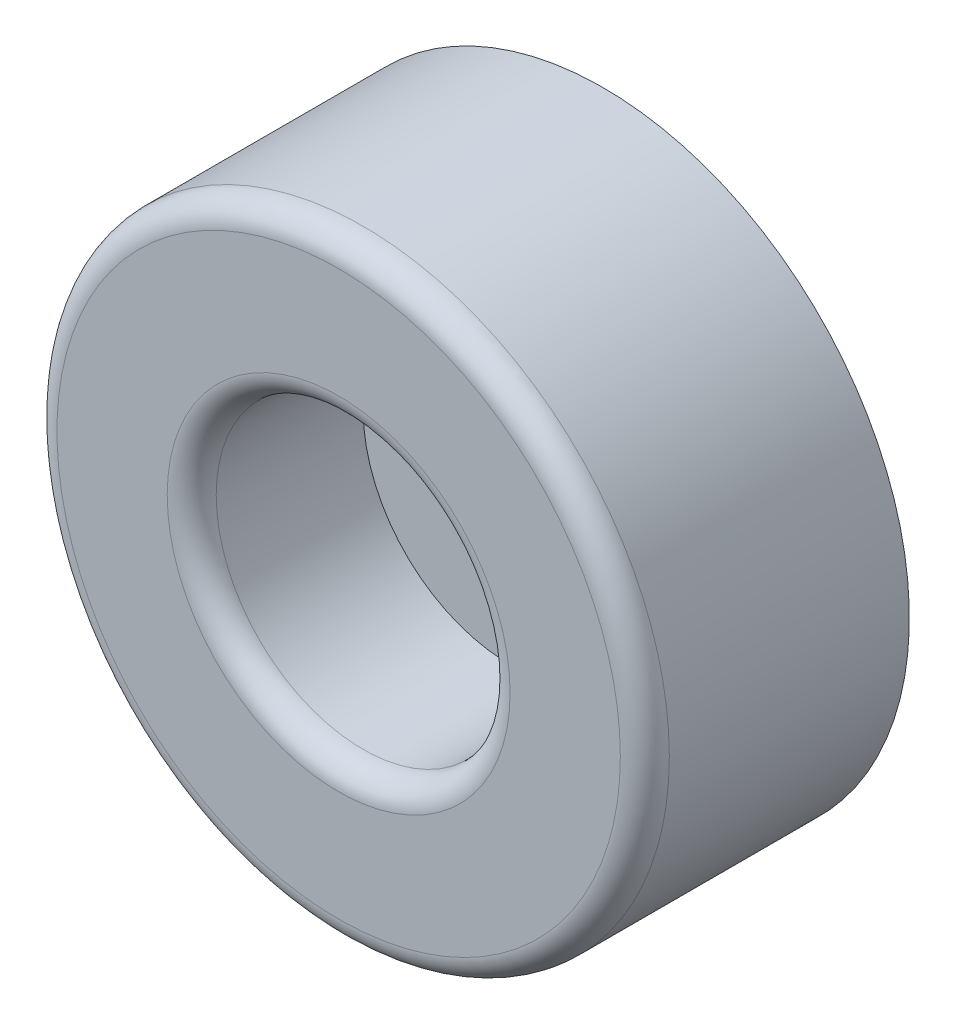
ISO-10303-21;
HEADER;
FILE_DESCRIPTION(('STEP AP214'),'2;1');
FILE_NAME('part.step','',(''),(''),'','','');
FILE_SCHEMA(('AUTOMOTIVE_DESIGN { 1 0 10303 214 1 1 1 1 }'));
ENDSEC;
DATA;
#1=APPLICATION_CONTEXT('core data for automotive mechanical design processes');
#2=APPLICATION_PROTOCOL_DEFINITION('international standard','automotive_design',2000,#1);
#3=PRODUCT_CONTEXT('',#1,'mechanical');
#4=PRODUCT('Part','Part','',(#3));
#5=PRODUCT_RELATED_PRODUCT_CATEGORY('part','',(#4));
#6=PRODUCT_DEFINITION_FORMATION('','',#4);
#7=PRODUCT_DEFINITION_CONTEXT('part definition',#1,'design');
#8=PRODUCT_DEFINITION('design','',#6,#7);
#9=PRODUCT_DEFINITION_SHAPE('','',#8);
#10=(LENGTH_UNIT() NAMED_UNIT(*) SI_UNIT(.MILLI.,.METRE.));
#11=(NAMED_UNIT(*) PLANE_ANGLE_UNIT() SI_UNIT($,.RADIAN.));
#12=(NAMED_UNIT(*) SI_UNIT($,.STERADIAN.) SOLID_ANGLE_UNIT());
#13=UNCERTAINTY_MEASURE_WITH_UNIT(LENGTH_MEASURE(1.E-05),#10,'distance_accuracy_value','');
#14=(GEOMETRIC_REPRESENTATION_CONTEXT(3) GLOBAL_UNCERTAINTY_ASSIGNED_CONTEXT((#13)) GLOBAL_UNIT_ASSIGNED_CONTEXT((#10,
#11,#12)) REPRESENTATION_CONTEXT('',''));
#15=CARTESIAN_POINT('',(0.,0.,0.));
#16=DIRECTION('',(0.,0.,1.));
#17=DIRECTION('',(1.,0.,0.));
#18=AXIS2_PLACEMENT_3D('',#15,#16,#17);
#19=CARTESIAN_POINT('',(0.,0.,10.8));
#20=DIRECTION('',(0.,0.,-1.));
#21=DIRECTION('',(-1.,0.,0.));
#22=AXIS2_PLACEMENT_3D('',#19,#20,#21);
#23=CYLINDRICAL_SURFACE('',#22,12.5);
#24=CARTESIAN_POINT('',(0.,0.,9.8));
#25=DIRECTION('',(0.,0.,1.));
#26=DIRECTION('',(1.,0.,0.));
#27=AXIS2_PLACEMENT_3D('',#24,#25,#26);
#28=CIRCLE('',#27,12.5);
#29=CARTESIAN_POINT('',(-12.5,0.,9.8));
#30=VERTEX_POINT('',#29);
#31=EDGE_CURVE('E57',#30,#30,#28,.F.);
#32=CARTESIAN_POINT('',(0.,0.,0.));
#33=DIRECTION('',(0.,0.,1.));
#34=DIRECTION('',(1.,0.,0.));
#35=AXIS2_PLACEMENT_3D('',#32,#33,#34);
#36=CIRCLE('',#35,12.5);
#37=CARTESIAN_POINT('',(-12.5,0.,0.));
#38=VERTEX_POINT('',#37);
#39=EDGE_CURVE('E73',#38,#38,#36,.T.);
#40=CARTESIAN_POINT('',(-12.5,0.,9.8));
#41=CARTESIAN_POINT('',(-12.5,0.,9.69791666666667));
#42=CARTESIAN_POINT('',(-12.5,0.,9.59583333333333));
#43=CARTESIAN_POINT('',(-12.5,0.,9.39166666666666));
#44=CARTESIAN_POINT('',(-12.5,0.,9.28958333333333));
#45=CARTESIAN_POINT('',(-12.5,0.,9.08541666666667));
#46=CARTESIAN_POINT('',(-12.5,0.,8.98333333333333));
#47=CARTESIAN_POINT('',(-12.5,0.,8.77916666666667));
#48=CARTESIAN_POINT('',(-12.5,0.,8.67708333333333));
#49=CARTESIAN_POINT('',(-12.5,0.,8.47291666666666));
#50=CARTESIAN_POINT('',(-12.5,0.,8.37083333333333));
#51=CARTESIAN_POINT('',(-12.5,0.,8.16666666666667));
#52=CARTESIAN_POINT('',(-12.5,0.,8.06458333333333));
#53=CARTESIAN_POINT('',(-12.5,0.,7.86041666666666));
#54=CARTESIAN_POINT('',(-12.5,0.,7.75833333333333));
#55=CARTESIAN_POINT('',(-12.5,0.,7.55416666666666));
#56=CARTESIAN_POINT('',(-12.5,0.,7.45208333333333));
#57=CARTESIAN_POINT('',(-12.5,0.,7.24791666666667));
#58=CARTESIAN_POINT('',(-12.5,0.,7.14583333333333));
#59=CARTESIAN_POINT('',(-12.5,0.,6.94166666666666));
#60=CARTESIAN_POINT('',(-12.5,0.,6.83958333333333));
#61=CARTESIAN_POINT('',(-12.5,0.,6.63541666666667));
#62=CARTESIAN_POINT('',(-12.5,0.,6.53333333333333));
#63=CARTESIAN_POINT('',(-12.5,0.,6.32916666666666));
#64=CARTESIAN_POINT('',(-12.5,0.,6.22708333333333));
#65=CARTESIAN_POINT('',(-12.5,0.,6.02291666666667));
#66=CARTESIAN_POINT('',(-12.5,0.,5.92083333333333));
#67=CARTESIAN_POINT('',(-12.5,0.,5.71666666666667));
#68=CARTESIAN_POINT('',(-12.5,0.,5.61458333333333));
#69=CARTESIAN_POINT('',(-12.5,0.,5.41041666666667));
#70=CARTESIAN_POINT('',(-12.5,0.,5.30833333333333));
#71=CARTESIAN_POINT('',(-12.5,0.,5.10416666666667));
#72=CARTESIAN_POINT('',(-12.5,0.,5.00208333333333));
#73=CARTESIAN_POINT('',(-12.5,0.,4.79791666666667));
#74=CARTESIAN_POINT('',(-12.5,0.,4.69583333333333));
#75=CARTESIAN_POINT('',(-12.5,0.,4.49166666666666));
#76=CARTESIAN_POINT('',(-12.5,0.,4.38958333333333));
#77=CARTESIAN_POINT('',(-12.5,0.,4.18541666666667));
#78=CARTESIAN_POINT('',(-12.5,0.,4.08333333333333));
#79=CARTESIAN_POINT('',(-12.5,0.,3.87916666666667));
#80=CARTESIAN_POINT('',(-12.5,0.,3.77708333333333));
#81=CARTESIAN_POINT('',(-12.5,0.,3.57291666666666));
#82=CARTESIAN_POINT('',(-12.5,0.,3.47083333333333));
#83=CARTESIAN_POINT('',(-12.5,0.,3.26666666666666));
#84=CARTESIAN_POINT('',(-12.5,0.,3.16458333333333));
#85=CARTESIAN_POINT('',(-12.5,0.,2.96041666666666));
#86=CARTESIAN_POINT('',(-12.5,0.,2.85833333333333));
#87=CARTESIAN_POINT('',(-12.5,0.,2.65416666666667));
#88=CARTESIAN_POINT('',(-12.5,0.,2.55208333333333));
#89=CARTESIAN_POINT('',(-12.5,0.,2.34791666666667));
#90=CARTESIAN_POINT('',(-12.5,0.,2.24583333333333));
#91=CARTESIAN_POINT('',(-12.5,0.,2.04166666666667));
#92=CARTESIAN_POINT('',(-12.5,0.,1.93958333333333));
#93=CARTESIAN_POINT('',(-12.5,0.,1.73541666666667));
#94=CARTESIAN_POINT('',(-12.5,0.,1.63333333333333));
#95=CARTESIAN_POINT('',(-12.5,0.,1.42916666666666));
#96=CARTESIAN_POINT('',(-12.5,0.,1.32708333333333));
#97=CARTESIAN_POINT('',(-12.5,0.,1.12291666666667));
#98=CARTESIAN_POINT('',(-12.5,0.,1.02083333333333));
#99=CARTESIAN_POINT('',(-12.5,0.,0.816666666666665));
#100=CARTESIAN_POINT('',(-12.5,0.,0.714583333333331));
#101=CARTESIAN_POINT('',(-12.5,0.,0.510416666666665));
#102=CARTESIAN_POINT('',(-12.5,0.,0.408333333333331));
#103=CARTESIAN_POINT('',(-12.5,0.,0.204166666666664));
#104=CARTESIAN_POINT('',(-12.5,0.,0.102083333333331));
#105=CARTESIAN_POINT('',(-12.5,0.,0.));
#106=B_SPLINE_CURVE_WITH_KNOTS('',3,(#40,#41,#42,#43,#44,#45,#46,#47,#48,#49,#50,#51,#52,#53,
#54,#55,#56,#57,#58,#59,#60,#61,#62,#63,#64,#65,#66,#67,#68,#69,#70,#71,#72,#73,#74,#75,#76,#77,
#78,#79,#80,#81,#82,#83,#84,#85,#86,#87,#88,#89,#90,#91,#92,#93,#94,#95,#96,#97,#98,#99,#100,
#101,#102,#103,#104,#105),.UNSPECIFIED.,.F.,.F.,(4,2,2,2,2,2,2,2,2,2,2,2,2,2,2,2,2,2,2,2,2,2,2,
2,2,2,2,2,2,2,2,2,4),(0.,0.306249999999999,0.6125,0.918749999999999,1.225,1.53125,1.8375,
2.14375,2.45,2.75625,3.0625,3.36875,3.675,3.98125,4.2875,4.59375,4.9,5.20625,5.5125,5.81875,
6.125,6.43125,6.7375,7.04375,7.35,7.65625,7.9625,8.26875,8.575,8.88125,9.1875,9.49375,9.8),.UNSPECIFIED.);
#107=EDGE_CURVE('BSEAM49',#30,#38,#106,.T.);
#108=ORIENTED_EDGE('',*,*,#31,.T.);
#109=ORIENTED_EDGE('',*,*,#39,.T.);
#110=ORIENTED_EDGE('',*,*,#107,.T.);
#111=ORIENTED_EDGE('',*,*,#107,.F.);
#112=EDGE_LOOP('',(#108,#110,#109,#111));
#113=FACE_BOUND('',#112,.T.);
#114=ADVANCED_FACE('F49',(#113),#23,.T.);
#115=CARTESIAN_POINT('',(0.,0.,10.8));
#116=DIRECTION('',(0.,0.,1.));
#117=DIRECTION('',(1.,0.,0.));
#118=AXIS2_PLACEMENT_3D('',#115,#116,#117);
#119=PLANE('',#118);
#120=CARTESIAN_POINT('',(0.,0.,10.8));
#121=DIRECTION('',(0.,0.,1.));
#122=DIRECTION('',(1.,0.,0.));
#123=AXIS2_PLACEMENT_3D('',#120,#121,#122);
#124=CIRCLE('',#123,11.5);
#125=CARTESIAN_POINT('',(11.5,0.,10.8));
#126=VERTEX_POINT('',#125);
#127=EDGE_CURVE('E62',#126,#126,#124,.T.);
#128=ORIENTED_EDGE('',*,*,#127,.T.);
#129=EDGE_LOOP('',(#128));
#130=FACE_BOUND('',#129,.T.);
#131=CARTESIAN_POINT('',(0.,0.,10.8));
#132=DIRECTION('',(0.,0.,1.));
#133=DIRECTION('',(1.,0.,0.));
#134=AXIS2_PLACEMENT_3D('',#131,#132,#133);
#135=CIRCLE('',#134,7.);
#136=CARTESIAN_POINT('',(7.,0.,10.8));
#137=VERTEX_POINT('',#136);
#138=EDGE_CURVE('E67',#137,#137,#135,.F.);
#139=ORIENTED_EDGE('',*,*,#138,.T.);
#140=EDGE_LOOP('',(#139));
#141=FACE_BOUND('',#140,.T.);
#142=ADVANCED_FACE('F109',(#130,#141),#119,.T.);
#143=CARTESIAN_POINT('',(0.,0.,0.));
#144=DIRECTION('',(0.,0.,1.));
#145=DIRECTION('',(1.,0.,0.));
#146=AXIS2_PLACEMENT_3D('',#143,#144,#145);
#147=PLANE('',#146);
#148=CARTESIAN_POINT('',(0.,0.,0.));
#149=DIRECTION('',(0.,0.,1.));
#150=DIRECTION('',(1.,0.,0.));
#151=AXIS2_PLACEMENT_3D('',#148,#149,#150);
#152=CIRCLE('',#151,2.5);
#153=CARTESIAN_POINT('',(2.5,0.,0.));
#154=VERTEX_POINT('',#153);
#155=EDGE_CURVE('E79',#154,#154,#152,.T.);
#156=ORIENTED_EDGE('',*,*,#155,.T.);
#157=EDGE_LOOP('',(#156));
#158=FACE_BOUND('',#157,.T.);
#159=ORIENTED_EDGE('',*,*,#39,.F.);
#160=EDGE_LOOP('',(#159));
#161=FACE_BOUND('',#160,.T.);
#162=ADVANCED_FACE('F90',(#158,#161),#147,.F.);
#163=CARTESIAN_POINT('',(0.,0.,3.8));
#164=DIRECTION('',(0.,0.,1.));
#165=DIRECTION('',(1.,0.,0.));
#166=AXIS2_PLACEMENT_3D('',#163,#164,#165);
#167=CYLINDRICAL_SURFACE('',#166,6.);
#168=CARTESIAN_POINT('',(0.,0.,9.8));
#169=DIRECTION('',(0.,0.,1.));
#170=DIRECTION('',(1.,0.,0.));
#171=AXIS2_PLACEMENT_3D('',#168,#169,#170);
#172=CIRCLE('',#171,6.);
#173=CARTESIAN_POINT('',(6.,0.,9.8));
#174=VERTEX_POINT('',#173);
#175=EDGE_CURVE('E10',#174,#174,#172,.T.);
#176=ORIENTED_EDGE('',*,*,#175,.T.);
#177=EDGE_LOOP('',(#176));
#178=FACE_BOUND('',#177,.T.);
#179=CARTESIAN_POINT('',(0.,0.,3.8));
#180=DIRECTION('',(0.,0.,1.));
#181=DIRECTION('',(1.,0.,0.));
#182=AXIS2_PLACEMENT_3D('',#179,#180,#181);
#183=CIRCLE('',#182,6.);
#184=CARTESIAN_POINT('',(6.,0.,3.8));
#185=VERTEX_POINT('',#184);
#186=EDGE_CURVE('E78',#185,#185,#183,.T.);
#187=ORIENTED_EDGE('',*,*,#186,.F.);
#188=EDGE_LOOP('',(#187));
#189=FACE_BOUND('',#188,.T.);
#190=ADVANCED_FACE('F106',(#178,#189),#167,.F.);
#191=CARTESIAN_POINT('',(0.,0.,3.8));
#192=DIRECTION('',(0.,0.,1.));
#193=DIRECTION('',(1.,0.,0.));
#194=AXIS2_PLACEMENT_3D('',#191,#192,#193);
#195=PLANE('',#194);
#196=CARTESIAN_POINT('',(0.,0.,3.8));
#197=DIRECTION('',(0.,0.,1.));
#198=DIRECTION('',(1.,0.,0.));
#199=AXIS2_PLACEMENT_3D('',#196,#197,#198);
#200=CIRCLE('',#199,2.5);
#201=CARTESIAN_POINT('',(2.5,0.,3.8));
#202=VERTEX_POINT('',#201);
#203=EDGE_CURVE('E74',#202,#202,#200,.T.);
#204=ORIENTED_EDGE('',*,*,#203,.F.);
#205=EDGE_LOOP('',(#204));
#206=FACE_BOUND('',#205,.T.);
#207=ORIENTED_EDGE('',*,*,#186,.T.);
#208=EDGE_LOOP('',(#207));
#209=FACE_BOUND('',#208,.T.);
#210=ADVANCED_FACE('F96',(#206,#209),#195,.T.);
#211=CARTESIAN_POINT('',(0.,0.,0.));
#212=DIRECTION('',(0.,0.,1.));
#213=DIRECTION('',(1.,0.,0.));
#214=AXIS2_PLACEMENT_3D('',#211,#212,#213);
#215=CYLINDRICAL_SURFACE('',#214,2.5);
#216=ORIENTED_EDGE('',*,*,#203,.T.);
#217=EDGE_LOOP('',(#216));
#218=FACE_BOUND('',#217,.T.);
#219=ORIENTED_EDGE('',*,*,#155,.F.);
#220=EDGE_LOOP('',(#219));
#221=FACE_BOUND('',#220,.T.);
#222=ADVANCED_FACE('F93',(#218,#221),#215,.F.);
#223=CARTESIAN_POINT('',(0.,0.,9.8));
#224=DIRECTION('',(0.,0.,1.));
#225=DIRECTION('',(1.,0.,0.));
#226=AXIS2_PLACEMENT_3D('',#223,#224,#225);
#227=TOROIDAL_SURFACE('',#226,11.5,1.);
#228=ORIENTED_EDGE('',*,*,#31,.F.);
#229=EDGE_LOOP('',(#228));
#230=FACE_BOUND('',#229,.T.);
#231=ORIENTED_EDGE('',*,*,#127,.F.);
#232=EDGE_LOOP('',(#231));
#233=FACE_BOUND('',#232,.T.);
#234=ADVANCED_FACE('F95',(#230,#233),#227,.T.);
#235=CARTESIAN_POINT('',(0.,0.,9.8));
#236=DIRECTION('',(0.,0.,1.));
#237=DIRECTION('',(1.,0.,0.));
#238=AXIS2_PLACEMENT_3D('',#235,#236,#237);
#239=TOROIDAL_SURFACE('',#238,7.,1.);
#240=ORIENTED_EDGE('',*,*,#138,.F.);
#241=EDGE_LOOP('',(#240));
#242=FACE_BOUND('',#241,.T.);
#243=ORIENTED_EDGE('',*,*,#175,.F.);
#244=EDGE_LOOP('',(#243));
#245=FACE_BOUND('',#244,.T.);
#246=ADVANCED_FACE('F51',(#242,#245),#239,.T.);
#247=CLOSED_SHELL('',(#114,#142,#162,#190,#210,#222,#234,#246));
#248=MANIFOLD_SOLID_BREP('B2',#247);
#249=ADVANCED_BREP_SHAPE_REPRESENTATION('',(#18,#248),#14);
#250=SHAPE_DEFINITION_REPRESENTATION(#9,#249);
ENDSEC;
END-ISO-10303-21;
